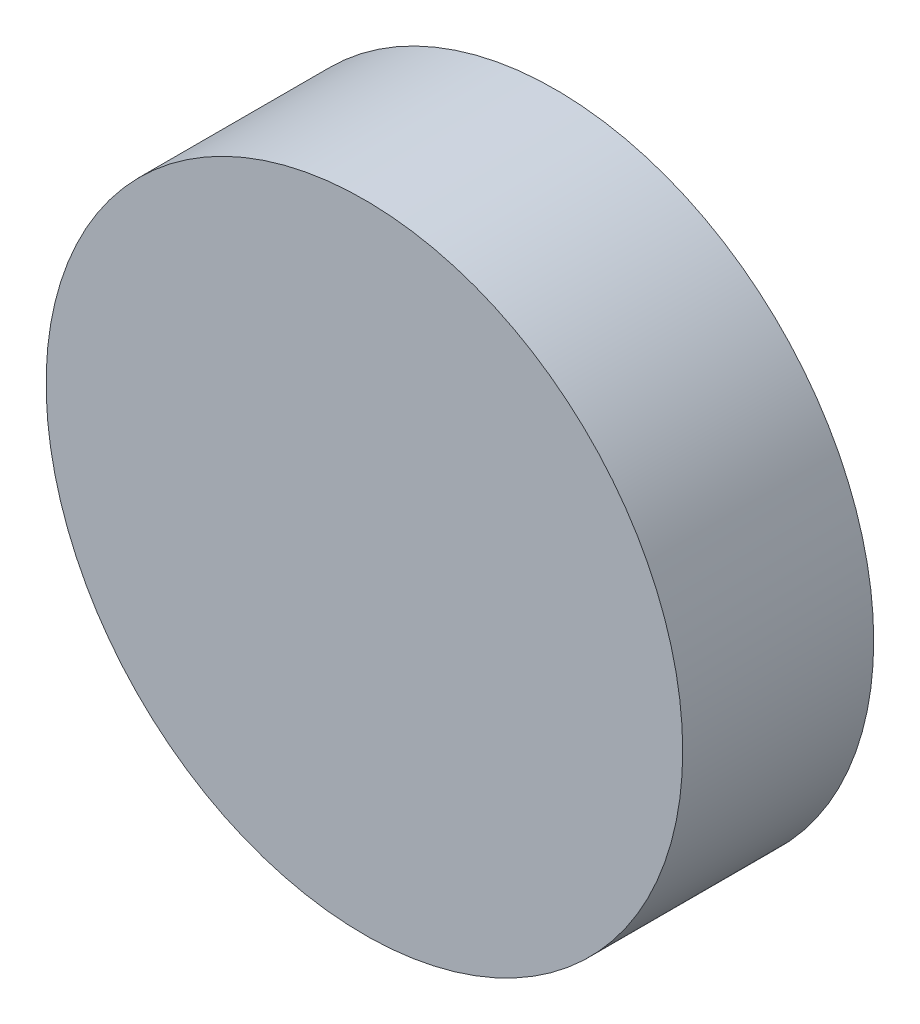
ISO-10303-21;
HEADER;
FILE_DESCRIPTION(('STEP AP214'),'2;1');
FILE_NAME('part.step','',(''),(''),'','','');
FILE_SCHEMA(('AUTOMOTIVE_DESIGN { 1 0 10303 214 1 1 1 1 }'));
ENDSEC;
DATA;
#1=APPLICATION_CONTEXT('core data for automotive mechanical design processes');
#2=APPLICATION_PROTOCOL_DEFINITION('international standard','automotive_design',2000,#1);
#3=PRODUCT_CONTEXT('',#1,'mechanical');
#4=PRODUCT('Part','Part','',(#3));
#5=PRODUCT_RELATED_PRODUCT_CATEGORY('part','',(#4));
#6=PRODUCT_DEFINITION_FORMATION('','',#4);
#7=PRODUCT_DEFINITION_CONTEXT('part definition',#1,'design');
#8=PRODUCT_DEFINITION('design','',#6,#7);
#9=PRODUCT_DEFINITION_SHAPE('','',#8);
#10=(LENGTH_UNIT() NAMED_UNIT(*) SI_UNIT(.MILLI.,.METRE.));
#11=(NAMED_UNIT(*) PLANE_ANGLE_UNIT() SI_UNIT($,.RADIAN.));
#12=(NAMED_UNIT(*) SI_UNIT($,.STERADIAN.) SOLID_ANGLE_UNIT());
#13=UNCERTAINTY_MEASURE_WITH_UNIT(LENGTH_MEASURE(1.E-05),#10,'distance_accuracy_value','');
#14=(GEOMETRIC_REPRESENTATION_CONTEXT(3) GLOBAL_UNCERTAINTY_ASSIGNED_CONTEXT((#13)) GLOBAL_UNIT_ASSIGNED_CONTEXT((#10,
#11,#12)) REPRESENTATION_CONTEXT('',''));
#15=CARTESIAN_POINT('',(0.,0.,0.));
#16=DIRECTION('',(0.,0.,1.));
#17=DIRECTION('',(1.,0.,0.));
#18=AXIS2_PLACEMENT_3D('',#15,#16,#17);
#19=CARTESIAN_POINT('',(0.,0.,3.));
#20=DIRECTION('',(0.,0.,-1.));
#21=DIRECTION('',(-1.,0.,0.));
#22=AXIS2_PLACEMENT_3D('',#19,#20,#21);
#23=CYLINDRICAL_SURFACE('',#22,5.);
#24=CARTESIAN_POINT('',(0.,0.,3.));
#25=DIRECTION('',(0.,0.,1.));
#26=DIRECTION('',(1.,0.,0.));
#27=AXIS2_PLACEMENT_3D('',#24,#25,#26);
#28=CIRCLE('',#27,5.);
#29=CARTESIAN_POINT('',(5.,0.,3.));
#30=VERTEX_POINT('',#29);
#31=EDGE_CURVE('E10',#30,#30,#28,.T.);
#32=ORIENTED_EDGE('',*,*,#31,.F.);
#33=EDGE_LOOP('',(#32));
#34=FACE_BOUND('',#33,.T.);
#35=CARTESIAN_POINT('',(0.,0.,0.));
#36=DIRECTION('',(0.,0.,1.));
#37=DIRECTION('',(1.,0.,0.));
#38=AXIS2_PLACEMENT_3D('',#35,#36,#37);
#39=CIRCLE('',#38,5.);
#40=CARTESIAN_POINT('',(5.,0.,0.));
#41=VERTEX_POINT('',#40);
#42=EDGE_CURVE('E33',#41,#41,#39,.T.);
#43=ORIENTED_EDGE('',*,*,#42,.T.);
#44=EDGE_LOOP('',(#43));
#45=FACE_BOUND('',#44,.T.);
#46=ADVANCED_FACE('F30',(#34,#45),#23,.T.);
#47=CARTESIAN_POINT('',(0.,0.,3.));
#48=DIRECTION('',(0.,0.,1.));
#49=DIRECTION('',(1.,0.,0.));
#50=AXIS2_PLACEMENT_3D('',#47,#48,#49);
#51=PLANE('',#50);
#52=ORIENTED_EDGE('',*,*,#31,.T.);
#53=EDGE_LOOP('',(#52));
#54=FACE_BOUND('',#53,.T.);
#55=ADVANCED_FACE('F45',(#54),#51,.T.);
#56=CARTESIAN_POINT('',(0.,0.,0.));
#57=DIRECTION('',(0.,0.,1.));
#58=DIRECTION('',(1.,0.,0.));
#59=AXIS2_PLACEMENT_3D('',#56,#57,#58);
#60=PLANE('',#59);
#61=ORIENTED_EDGE('',*,*,#42,.F.);
#62=EDGE_LOOP('',(#61));
#63=FACE_BOUND('',#62,.T.);
#64=ADVANCED_FACE('F43',(#63),#60,.F.);
#65=CLOSED_SHELL('',(#46,#55,#64));
#66=MANIFOLD_SOLID_BREP('B2',#65);
#67=ADVANCED_BREP_SHAPE_REPRESENTATION('',(#18,#66),#14);
#68=SHAPE_DEFINITION_REPRESENTATION(#9,#67);
ENDSEC;
END-ISO-10303-21;
